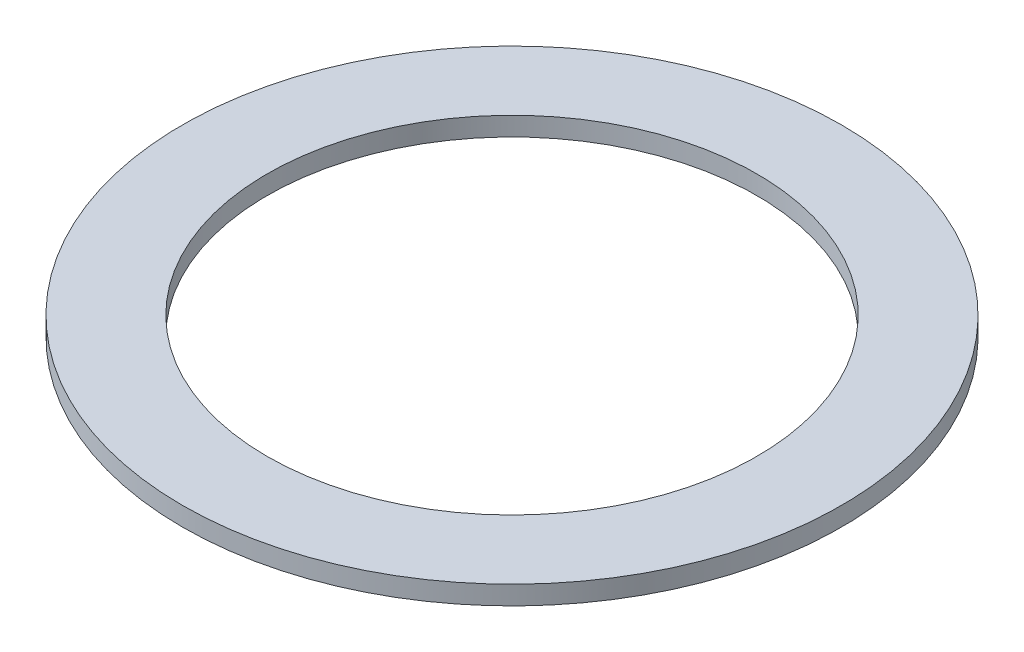
ISO-10303-21;
HEADER;
FILE_DESCRIPTION(('STEP AP214'),'2;1');
FILE_NAME('part.step','',(''),(''),'','','');
FILE_SCHEMA(('AUTOMOTIVE_DESIGN { 1 0 10303 214 1 1 1 1 }'));
ENDSEC;
DATA;
#1=APPLICATION_CONTEXT('core data for automotive mechanical design processes');
#2=APPLICATION_PROTOCOL_DEFINITION('international standard','automotive_design',2000,#1);
#3=PRODUCT_CONTEXT('',#1,'mechanical');
#4=PRODUCT('Part','Part','',(#3));
#5=PRODUCT_RELATED_PRODUCT_CATEGORY('part','',(#4));
#6=PRODUCT_DEFINITION_FORMATION('','',#4);
#7=PRODUCT_DEFINITION_CONTEXT('part definition',#1,'design');
#8=PRODUCT_DEFINITION('design','',#6,#7);
#9=PRODUCT_DEFINITION_SHAPE('','',#8);
#10=(LENGTH_UNIT() NAMED_UNIT(*) SI_UNIT(.MILLI.,.METRE.));
#11=(NAMED_UNIT(*) PLANE_ANGLE_UNIT() SI_UNIT($,.RADIAN.));
#12=(NAMED_UNIT(*) SI_UNIT($,.STERADIAN.) SOLID_ANGLE_UNIT());
#13=UNCERTAINTY_MEASURE_WITH_UNIT(LENGTH_MEASURE(1.E-05),#10,'distance_accuracy_value','');
#14=(GEOMETRIC_REPRESENTATION_CONTEXT(3) GLOBAL_UNCERTAINTY_ASSIGNED_CONTEXT((#13)) GLOBAL_UNIT_ASSIGNED_CONTEXT((#10,
#11,#12)) REPRESENTATION_CONTEXT('',''));
#15=CARTESIAN_POINT('',(0.,0.,0.));
#16=DIRECTION('',(0.,0.,1.));
#17=DIRECTION('',(1.,0.,0.));
#18=AXIS2_PLACEMENT_3D('',#15,#16,#17);
#19=CARTESIAN_POINT('',(0.,1.,0.));
#20=DIRECTION('',(0.,1.,0.));
#21=DIRECTION('',(0.,0.,1.));
#22=AXIS2_PLACEMENT_3D('',#19,#20,#21);
#23=PLANE('',#22);
#24=CARTESIAN_POINT('',(0.,1.,0.));
#25=DIRECTION('',(0.,1.,0.));
#26=DIRECTION('',(0.,0.,1.));
#27=AXIS2_PLACEMENT_3D('',#24,#25,#26);
#28=CIRCLE('',#27,17.5);
#29=CARTESIAN_POINT('',(0.,1.,17.5));
#30=VERTEX_POINT('',#29);
#31=EDGE_CURVE('E10',#30,#30,#28,.T.);
#32=ORIENTED_EDGE('',*,*,#31,.T.);
#33=EDGE_LOOP('',(#32));
#34=FACE_BOUND('',#33,.T.);
#35=CARTESIAN_POINT('',(0.,1.,0.));
#36=DIRECTION('',(0.,1.,0.));
#37=DIRECTION('',(0.,0.,1.));
#38=AXIS2_PLACEMENT_3D('',#35,#36,#37);
#39=CIRCLE('',#38,13.);
#40=CARTESIAN_POINT('',(0.,1.,13.));
#41=VERTEX_POINT('',#40);
#42=EDGE_CURVE('E50',#41,#41,#39,.T.);
#43=ORIENTED_EDGE('',*,*,#42,.F.);
#44=EDGE_LOOP('',(#43));
#45=FACE_BOUND('',#44,.T.);
#46=ADVANCED_FACE('F37',(#34,#45),#23,.T.);
#47=CARTESIAN_POINT('',(0.,0.,0.));
#48=DIRECTION('',(0.,1.,0.));
#49=DIRECTION('',(0.,0.,1.));
#50=AXIS2_PLACEMENT_3D('',#47,#48,#49);
#51=PLANE('',#50);
#52=CARTESIAN_POINT('',(0.,0.,0.));
#53=DIRECTION('',(0.,1.,0.));
#54=DIRECTION('',(0.,0.,1.));
#55=AXIS2_PLACEMENT_3D('',#52,#53,#54);
#56=CIRCLE('',#55,17.5);
#57=CARTESIAN_POINT('',(0.,0.,17.5));
#58=VERTEX_POINT('',#57);
#59=EDGE_CURVE('E41',#58,#58,#56,.T.);
#60=ORIENTED_EDGE('',*,*,#59,.F.);
#61=EDGE_LOOP('',(#60));
#62=FACE_BOUND('',#61,.T.);
#63=CARTESIAN_POINT('',(0.,0.,0.));
#64=DIRECTION('',(0.,1.,0.));
#65=DIRECTION('',(0.,0.,1.));
#66=AXIS2_PLACEMENT_3D('',#63,#64,#65);
#67=CIRCLE('',#66,13.);
#68=CARTESIAN_POINT('',(0.,0.,13.));
#69=VERTEX_POINT('',#68);
#70=EDGE_CURVE('E52',#69,#69,#67,.T.);
#71=ORIENTED_EDGE('',*,*,#70,.T.);
#72=EDGE_LOOP('',(#71));
#73=FACE_BOUND('',#72,.T.);
#74=ADVANCED_FACE('F64',(#62,#73),#51,.F.);
#75=CARTESIAN_POINT('',(0.,1.,0.));
#76=DIRECTION('',(0.,-1.,0.));
#77=DIRECTION('',(0.,0.,-1.));
#78=AXIS2_PLACEMENT_3D('',#75,#76,#77);
#79=CYLINDRICAL_SURFACE('',#78,17.5);
#80=ORIENTED_EDGE('',*,*,#31,.F.);
#81=EDGE_LOOP('',(#80));
#82=FACE_BOUND('',#81,.T.);
#83=ORIENTED_EDGE('',*,*,#59,.T.);
#84=EDGE_LOOP('',(#83));
#85=FACE_BOUND('',#84,.T.);
#86=ADVANCED_FACE('F39',(#82,#85),#79,.T.);
#87=CARTESIAN_POINT('',(0.,1.,0.));
#88=DIRECTION('',(0.,-1.,0.));
#89=DIRECTION('',(0.,0.,-1.));
#90=AXIS2_PLACEMENT_3D('',#87,#88,#89);
#91=CYLINDRICAL_SURFACE('',#90,13.);
#92=ORIENTED_EDGE('',*,*,#42,.T.);
#93=EDGE_LOOP('',(#92));
#94=FACE_BOUND('',#93,.T.);
#95=ORIENTED_EDGE('',*,*,#70,.F.);
#96=EDGE_LOOP('',(#95));
#97=FACE_BOUND('',#96,.T.);
#98=ADVANCED_FACE('F60',(#94,#97),#91,.F.);
#99=CLOSED_SHELL('',(#46,#74,#86,#98));
#100=MANIFOLD_SOLID_BREP('B2',#99);
#101=ADVANCED_BREP_SHAPE_REPRESENTATION('',(#18,#100),#14);
#102=SHAPE_DEFINITION_REPRESENTATION(#9,#101);
ENDSEC;
END-ISO-10303-21;
